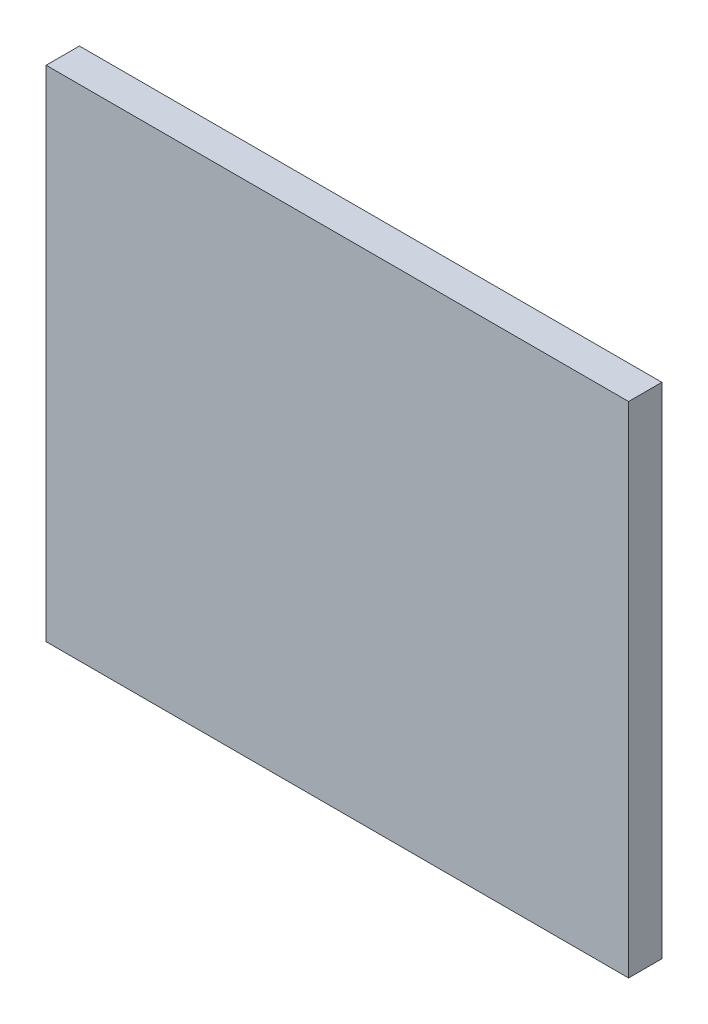
ISO-10303-21;
HEADER;
FILE_DESCRIPTION(('STEP AP214'),'2;1');
FILE_NAME('part.step','',(''),(''),'','','');
FILE_SCHEMA(('AUTOMOTIVE_DESIGN { 1 0 10303 214 1 1 1 1 }'));
ENDSEC;
DATA;
#1=APPLICATION_CONTEXT('core data for automotive mechanical design processes');
#2=APPLICATION_PROTOCOL_DEFINITION('international standard','automotive_design',2000,#1);
#3=PRODUCT_CONTEXT('',#1,'mechanical');
#4=PRODUCT('Part','Part','',(#3));
#5=PRODUCT_RELATED_PRODUCT_CATEGORY('part','',(#4));
#6=PRODUCT_DEFINITION_FORMATION('','',#4);
#7=PRODUCT_DEFINITION_CONTEXT('part definition',#1,'design');
#8=PRODUCT_DEFINITION('design','',#6,#7);
#9=PRODUCT_DEFINITION_SHAPE('','',#8);
#10=(LENGTH_UNIT() NAMED_UNIT(*) SI_UNIT(.MILLI.,.METRE.));
#11=(NAMED_UNIT(*) PLANE_ANGLE_UNIT() SI_UNIT($,.RADIAN.));
#12=(NAMED_UNIT(*) SI_UNIT($,.STERADIAN.) SOLID_ANGLE_UNIT());
#13=UNCERTAINTY_MEASURE_WITH_UNIT(LENGTH_MEASURE(1.E-05),#10,'distance_accuracy_value','');
#14=(GEOMETRIC_REPRESENTATION_CONTEXT(3) GLOBAL_UNCERTAINTY_ASSIGNED_CONTEXT((#13)) GLOBAL_UNIT_ASSIGNED_CONTEXT((#10,
#11,#12)) REPRESENTATION_CONTEXT('',''));
#15=CARTESIAN_POINT('',(0.,0.,0.));
#16=DIRECTION('',(0.,0.,1.));
#17=DIRECTION('',(1.,0.,0.));
#18=AXIS2_PLACEMENT_3D('',#15,#16,#17);
#19=CARTESIAN_POINT('',(-518.489347611489,-229.299072168843,-816.486147986318));
#20=DIRECTION('',(0.,0.,1.));
#21=DIRECTION('',(1.,0.,0.));
#22=AXIS2_PLACEMENT_3D('',#19,#20,#21);
#23=PLANE('',#22);
#24=DIRECTION('',(1.,0.,0.));
#25=VECTOR('',#24,1.);
#26=CARTESIAN_POINT('',(-518.489347611489,-229.299072168843,-816.486147986318));
#27=LINE('',#26,#25);
#28=CARTESIAN_POINT('',(-508.489347611488,-229.299072168843,-816.486147986318));
#29=VERTEX_POINT('',#28);
#30=CARTESIAN_POINT('',(-578.489347611488,-229.299072168843,-816.486147986318));
#31=VERTEX_POINT('',#30);
#32=EDGE_CURVE('E89',#29,#31,#27,.F.);
#33=ORIENTED_EDGE('',*,*,#32,.T.);
#34=DIRECTION('',(0.,1.,0.));
#35=VECTOR('',#34,1.);
#36=CARTESIAN_POINT('',(-578.489347611488,-229.299072168843,-816.486147986318));
#37=LINE('',#36,#35);
#38=CARTESIAN_POINT('',(-578.489347611488,-169.299072168843,-816.486147986318));
#39=VERTEX_POINT('',#38);
#40=EDGE_CURVE('E56',#31,#39,#37,.T.);
#41=ORIENTED_EDGE('',*,*,#40,.T.);
#42=DIRECTION('',(1.,0.,0.));
#43=VECTOR('',#42,1.);
#44=CARTESIAN_POINT('',(-518.489347611489,-169.299072168843,-816.486147986318));
#45=LINE('',#44,#43);
#46=CARTESIAN_POINT('',(-508.489347611488,-169.299072168843,-816.486147986318));
#47=VERTEX_POINT('',#46);
#48=EDGE_CURVE('E58',#39,#47,#45,.T.);
#49=ORIENTED_EDGE('',*,*,#48,.T.);
#50=DIRECTION('',(0.,1.,0.));
#51=VECTOR('',#50,1.);
#52=CARTESIAN_POINT('',(-508.489347611488,-229.299072168843,-816.486147986318));
#53=LINE('',#52,#51);
#54=EDGE_CURVE('E20',#47,#29,#53,.F.);
#55=ORIENTED_EDGE('',*,*,#54,.T.);
#56=EDGE_LOOP('',(#33,#41,#49,#55));
#57=FACE_BOUND('',#56,.T.);
#58=ADVANCED_FACE('F17',(#57),#23,.F.);
#59=CARTESIAN_POINT('',(-508.489347611488,-229.299072168843,-814.486147986318));
#60=DIRECTION('',(-1.,0.,0.));
#61=DIRECTION('',(0.,0.,1.));
#62=AXIS2_PLACEMENT_3D('',#59,#60,#61);
#63=PLANE('',#62);
#64=ORIENTED_EDGE('',*,*,#54,.F.);
#65=DIRECTION('',(0.,0.,-1.));
#66=VECTOR('',#65,1.);
#67=CARTESIAN_POINT('',(-508.489347611488,-169.299072168843,-814.486147986318));
#68=LINE('',#67,#66);
#69=CARTESIAN_POINT('',(-508.489347611488,-169.299072168843,-812.486147986318));
#70=VERTEX_POINT('',#69);
#71=EDGE_CURVE('E65',#47,#70,#68,.F.);
#72=ORIENTED_EDGE('',*,*,#71,.T.);
#73=DIRECTION('',(0.,1.,0.));
#74=VECTOR('',#73,1.);
#75=CARTESIAN_POINT('',(-508.489347611488,-229.299072168843,-812.486147986318));
#76=LINE('',#75,#74);
#77=CARTESIAN_POINT('',(-508.489347611488,-229.299072168843,-812.486147986318));
#78=VERTEX_POINT('',#77);
#79=EDGE_CURVE('E94',#78,#70,#76,.T.);
#80=ORIENTED_EDGE('',*,*,#79,.F.);
#81=DIRECTION('',(0.,0.,1.));
#82=VECTOR('',#81,1.);
#83=CARTESIAN_POINT('',(-508.489347611488,-229.299072168843,-814.486147986318));
#84=LINE('',#83,#82);
#85=EDGE_CURVE('E70',#78,#29,#84,.F.);
#86=ORIENTED_EDGE('',*,*,#85,.T.);
#87=EDGE_LOOP('',(#64,#72,#80,#86));
#88=FACE_BOUND('',#87,.T.);
#89=ADVANCED_FACE('F67',(#88),#63,.F.);
#90=CARTESIAN_POINT('',(-518.489347611489,-169.299072168843,-814.486147986318));
#91=DIRECTION('',(0.,-1.,0.));
#92=DIRECTION('',(0.,0.,-1.));
#93=AXIS2_PLACEMENT_3D('',#90,#91,#92);
#94=PLANE('',#93);
#95=ORIENTED_EDGE('',*,*,#48,.F.);
#96=DIRECTION('',(0.,0.,-1.));
#97=VECTOR('',#96,1.);
#98=CARTESIAN_POINT('',(-578.489347611488,-169.299072168843,-814.486147986318));
#99=LINE('',#98,#97);
#100=CARTESIAN_POINT('',(-578.489347611488,-169.299072168843,-812.486147986318));
#101=VERTEX_POINT('',#100);
#102=EDGE_CURVE('E82',#39,#101,#99,.F.);
#103=ORIENTED_EDGE('',*,*,#102,.T.);
#104=DIRECTION('',(1.,0.,0.));
#105=VECTOR('',#104,1.);
#106=CARTESIAN_POINT('',(-518.489347611489,-169.299072168843,-812.486147986318));
#107=LINE('',#106,#105);
#108=EDGE_CURVE('E75',#70,#101,#107,.F.);
#109=ORIENTED_EDGE('',*,*,#108,.F.);
#110=ORIENTED_EDGE('',*,*,#71,.F.);
#111=EDGE_LOOP('',(#95,#103,#109,#110));
#112=FACE_BOUND('',#111,.T.);
#113=ADVANCED_FACE('F73',(#112),#94,.F.);
#114=CARTESIAN_POINT('',(-578.489347611488,-229.299072168843,-814.486147986318));
#115=DIRECTION('',(1.,0.,0.));
#116=DIRECTION('',(0.,0.,-1.));
#117=AXIS2_PLACEMENT_3D('',#114,#115,#116);
#118=PLANE('',#117);
#119=ORIENTED_EDGE('',*,*,#40,.F.);
#120=DIRECTION('',(0.,0.,1.));
#121=VECTOR('',#120,1.);
#122=CARTESIAN_POINT('',(-578.489347611488,-229.299072168843,-814.486147986318));
#123=LINE('',#122,#121);
#124=CARTESIAN_POINT('',(-578.489347611488,-229.299072168843,-812.486147986318));
#125=VERTEX_POINT('',#124);
#126=EDGE_CURVE('E36',#31,#125,#123,.T.);
#127=ORIENTED_EDGE('',*,*,#126,.T.);
#128=DIRECTION('',(0.,1.,0.));
#129=VECTOR('',#128,1.);
#130=CARTESIAN_POINT('',(-578.489347611488,-229.299072168843,-812.486147986318));
#131=LINE('',#130,#129);
#132=EDGE_CURVE('E27',#101,#125,#131,.F.);
#133=ORIENTED_EDGE('',*,*,#132,.F.);
#134=ORIENTED_EDGE('',*,*,#102,.F.);
#135=EDGE_LOOP('',(#119,#127,#133,#134));
#136=FACE_BOUND('',#135,.T.);
#137=ADVANCED_FACE('F102',(#136),#118,.F.);
#138=CARTESIAN_POINT('',(-518.489347611489,-229.299072168843,-814.486147986318));
#139=DIRECTION('',(0.,1.,0.));
#140=DIRECTION('',(0.,0.,1.));
#141=AXIS2_PLACEMENT_3D('',#138,#139,#140);
#142=PLANE('',#141);
#143=ORIENTED_EDGE('',*,*,#32,.F.);
#144=ORIENTED_EDGE('',*,*,#85,.F.);
#145=DIRECTION('',(1.,0.,0.));
#146=VECTOR('',#145,1.);
#147=CARTESIAN_POINT('',(-518.489347611489,-229.299072168843,-812.486147986318));
#148=LINE('',#147,#146);
#149=EDGE_CURVE('E11',#125,#78,#148,.T.);
#150=ORIENTED_EDGE('',*,*,#149,.F.);
#151=ORIENTED_EDGE('',*,*,#126,.F.);
#152=EDGE_LOOP('',(#143,#144,#150,#151));
#153=FACE_BOUND('',#152,.T.);
#154=ADVANCED_FACE('F104',(#153),#142,.F.);
#155=CARTESIAN_POINT('',(-518.489347611489,-229.299072168843,-812.486147986318));
#156=DIRECTION('',(0.,0.,1.));
#157=DIRECTION('',(1.,0.,0.));
#158=AXIS2_PLACEMENT_3D('',#155,#156,#157);
#159=PLANE('',#158);
#160=ORIENTED_EDGE('',*,*,#132,.T.);
#161=ORIENTED_EDGE('',*,*,#149,.T.);
#162=ORIENTED_EDGE('',*,*,#79,.T.);
#163=ORIENTED_EDGE('',*,*,#108,.T.);
#164=EDGE_LOOP('',(#160,#161,#162,#163));
#165=FACE_BOUND('',#164,.T.);
#166=ADVANCED_FACE('F101',(#165),#159,.T.);
#167=CLOSED_SHELL('',(#58,#89,#113,#137,#154,#166));
#168=MANIFOLD_SOLID_BREP('B1',#167);
#169=ADVANCED_BREP_SHAPE_REPRESENTATION('',(#18,#168),#14);
#170=SHAPE_DEFINITION_REPRESENTATION(#9,#169);
ENDSEC;
END-ISO-10303-21;
